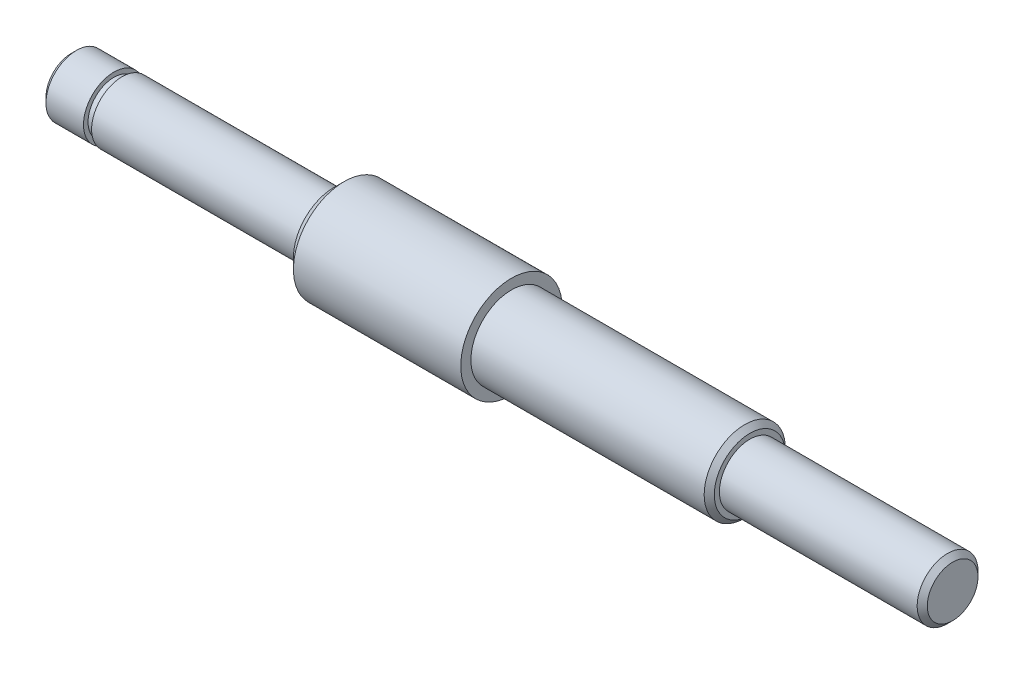
ISO-10303-21;
HEADER;
FILE_DESCRIPTION(('STEP AP214'),'2;1');
FILE_NAME('part.step','',(''),(''),'','','');
FILE_SCHEMA(('AUTOMOTIVE_DESIGN { 1 0 10303 214 1 1 1 1 }'));
ENDSEC;
DATA;
#1=APPLICATION_CONTEXT('core data for automotive mechanical design processes');
#2=APPLICATION_PROTOCOL_DEFINITION('international standard','automotive_design',2000,#1);
#3=PRODUCT_CONTEXT('',#1,'mechanical');
#4=PRODUCT('Part','Part','',(#3));
#5=PRODUCT_RELATED_PRODUCT_CATEGORY('part','',(#4));
#6=PRODUCT_DEFINITION_FORMATION('','',#4);
#7=PRODUCT_DEFINITION_CONTEXT('part definition',#1,'design');
#8=PRODUCT_DEFINITION('design','',#6,#7);
#9=PRODUCT_DEFINITION_SHAPE('','',#8);
#10=(LENGTH_UNIT() NAMED_UNIT(*) SI_UNIT(.MILLI.,.METRE.));
#11=(NAMED_UNIT(*) PLANE_ANGLE_UNIT() SI_UNIT($,.RADIAN.));
#12=(NAMED_UNIT(*) SI_UNIT($,.STERADIAN.) SOLID_ANGLE_UNIT());
#13=UNCERTAINTY_MEASURE_WITH_UNIT(LENGTH_MEASURE(1.E-05),#10,'distance_accuracy_value','');
#14=(GEOMETRIC_REPRESENTATION_CONTEXT(3) GLOBAL_UNCERTAINTY_ASSIGNED_CONTEXT((#13)) GLOBAL_UNIT_ASSIGNED_CONTEXT((#10,
#11,#12)) REPRESENTATION_CONTEXT('',''));
#15=CARTESIAN_POINT('',(0.,0.,0.));
#16=DIRECTION('',(0.,0.,1.));
#17=DIRECTION('',(1.,0.,0.));
#18=AXIS2_PLACEMENT_3D('',#15,#16,#17);
#19=CARTESIAN_POINT('',(43.45,0.,0.));
#20=DIRECTION('',(-1.,0.,0.));
#21=DIRECTION('',(0.,0.,1.));
#22=AXIS2_PLACEMENT_3D('',#19,#20,#21);
#23=PLANE('',#22);
#24=CARTESIAN_POINT('',(43.45,0.,0.));
#25=DIRECTION('',(-1.,0.,0.));
#26=DIRECTION('',(0.,0.,1.));
#27=AXIS2_PLACEMENT_3D('',#24,#25,#26);
#28=CIRCLE('',#27,2.50000000000006);
#29=CARTESIAN_POINT('',(43.45,0.,2.50000000000006));
#30=VERTEX_POINT('',#29);
#31=EDGE_CURVE('E64',#30,#30,#28,.F.);
#32=ORIENTED_EDGE('',*,*,#31,.T.);
#33=EDGE_LOOP('',(#32));
#34=FACE_BOUND('',#33,.T.);
#35=ADVANCED_FACE('F43',(#34),#23,.F.);
#36=CARTESIAN_POINT('',(43.45,0.,0.));
#37=DIRECTION('',(1.,0.,0.));
#38=DIRECTION('',(0.,0.,-1.));
#39=AXIS2_PLACEMENT_3D('',#36,#37,#38);
#40=CYLINDRICAL_SURFACE('',#39,3.00000000000002);
#41=CARTESIAN_POINT('',(42.95,0.,0.));
#42=DIRECTION('',(-1.,0.,0.));
#43=DIRECTION('',(0.,0.,1.));
#44=AXIS2_PLACEMENT_3D('',#41,#42,#43);
#45=CIRCLE('',#44,3.00000000000002);
#46=CARTESIAN_POINT('',(42.95,0.,3.00000000000002));
#47=VERTEX_POINT('',#46);
#48=EDGE_CURVE('E58',#47,#47,#45,.T.);
#49=ORIENTED_EDGE('',*,*,#48,.T.);
#50=EDGE_LOOP('',(#49));
#51=FACE_BOUND('',#50,.T.);
#52=CARTESIAN_POINT('',(23.45,0.,0.));
#53=DIRECTION('',(1.,0.,0.));
#54=DIRECTION('',(0.,0.,-1.));
#55=AXIS2_PLACEMENT_3D('',#52,#53,#54);
#56=CIRCLE('',#55,3.);
#57=CARTESIAN_POINT('',(23.45,0.,-3.));
#58=VERTEX_POINT('',#57);
#59=EDGE_CURVE('E86',#58,#58,#56,.T.);
#60=ORIENTED_EDGE('',*,*,#59,.T.);
#61=EDGE_LOOP('',(#60));
#62=FACE_BOUND('',#61,.T.);
#63=ADVANCED_FACE('F139',(#51,#62),#40,.T.);
#64=CARTESIAN_POINT('',(23.45,0.,3.));
#65=DIRECTION('',(-1.,0.,0.));
#66=DIRECTION('',(0.,0.,1.));
#67=AXIS2_PLACEMENT_3D('',#64,#65,#66);
#68=PLANE('',#67);
#69=CARTESIAN_POINT('',(23.45,0.,0.));
#70=DIRECTION('',(-1.,0.,0.));
#71=DIRECTION('',(0.,0.,1.));
#72=AXIS2_PLACEMENT_3D('',#69,#70,#71);
#73=CIRCLE('',#72,3.5);
#74=CARTESIAN_POINT('',(23.45,0.,3.5));
#75=VERTEX_POINT('',#74);
#76=EDGE_CURVE('E82',#75,#75,#73,.F.);
#77=ORIENTED_EDGE('',*,*,#76,.T.);
#78=EDGE_LOOP('',(#77));
#79=FACE_BOUND('',#78,.T.);
#80=ORIENTED_EDGE('',*,*,#59,.F.);
#81=EDGE_LOOP('',(#80));
#82=FACE_BOUND('',#81,.T.);
#83=ADVANCED_FACE('F145',(#79,#82),#68,.F.);
#84=CARTESIAN_POINT('',(43.45,0.,0.));
#85=DIRECTION('',(1.,0.,0.));
#86=DIRECTION('',(0.,0.,-1.));
#87=AXIS2_PLACEMENT_3D('',#84,#85,#86);
#88=CYLINDRICAL_SURFACE('',#87,4.);
#89=CARTESIAN_POINT('',(22.95,0.,0.));
#90=DIRECTION('',(-1.,0.,0.));
#91=DIRECTION('',(0.,0.,1.));
#92=AXIS2_PLACEMENT_3D('',#89,#90,#91);
#93=CIRCLE('',#92,4.);
#94=CARTESIAN_POINT('',(22.95,0.,4.));
#95=VERTEX_POINT('',#94);
#96=EDGE_CURVE('E78',#95,#95,#93,.T.);
#97=ORIENTED_EDGE('',*,*,#96,.T.);
#98=EDGE_LOOP('',(#97));
#99=FACE_BOUND('',#98,.T.);
#100=CARTESIAN_POINT('',(-0.0499999999999945,0.,0.));
#101=DIRECTION('',(1.,0.,0.));
#102=DIRECTION('',(0.,0.,-1.));
#103=AXIS2_PLACEMENT_3D('',#100,#101,#102);
#104=CIRCLE('',#103,4.);
#105=CARTESIAN_POINT('',(-0.0499999999999945,0.,-4.));
#106=VERTEX_POINT('',#105);
#107=EDGE_CURVE('E90',#106,#106,#104,.T.);
#108=ORIENTED_EDGE('',*,*,#107,.T.);
#109=EDGE_LOOP('',(#108));
#110=FACE_BOUND('',#109,.T.);
#111=ADVANCED_FACE('F180',(#99,#110),#88,.T.);
#112=CARTESIAN_POINT('',(-0.0499999999999978,0.,4.));
#113=DIRECTION('',(-1.,0.,0.));
#114=DIRECTION('',(0.,0.,1.));
#115=AXIS2_PLACEMENT_3D('',#112,#113,#114);
#116=PLANE('',#115);
#117=ORIENTED_EDGE('',*,*,#107,.F.);
#118=EDGE_LOOP('',(#117));
#119=FACE_BOUND('',#118,.T.);
#120=CARTESIAN_POINT('',(-0.0499999999999945,0.,0.));
#121=DIRECTION('',(1.,0.,0.));
#122=DIRECTION('',(0.,0.,-1.));
#123=AXIS2_PLACEMENT_3D('',#120,#121,#122);
#124=CIRCLE('',#123,5.);
#125=CARTESIAN_POINT('',(-0.0499999999999945,0.,-5.));
#126=VERTEX_POINT('',#125);
#127=EDGE_CURVE('E94',#126,#126,#124,.T.);
#128=ORIENTED_EDGE('',*,*,#127,.T.);
#129=EDGE_LOOP('',(#128));
#130=FACE_BOUND('',#129,.T.);
#131=ADVANCED_FACE('F184',(#119,#130),#116,.F.);
#132=CARTESIAN_POINT('',(43.45,0.,0.));
#133=DIRECTION('',(1.,0.,0.));
#134=DIRECTION('',(0.,0.,-1.));
#135=AXIS2_PLACEMENT_3D('',#132,#133,#134);
#136=CYLINDRICAL_SURFACE('',#135,5.);
#137=CARTESIAN_POINT('',(-16.55,0.,0.));
#138=DIRECTION('',(1.,0.,0.));
#139=DIRECTION('',(0.,0.,-1.));
#140=AXIS2_PLACEMENT_3D('',#137,#138,#139);
#141=CIRCLE('',#140,5.);
#142=CARTESIAN_POINT('',(-16.55,0.,-5.));
#143=VERTEX_POINT('',#142);
#144=EDGE_CURVE('E52',#143,#143,#141,.T.);
#145=ORIENTED_EDGE('',*,*,#144,.T.);
#146=EDGE_LOOP('',(#145));
#147=FACE_BOUND('',#146,.T.);
#148=ORIENTED_EDGE('',*,*,#127,.F.);
#149=EDGE_LOOP('',(#148));
#150=FACE_BOUND('',#149,.T.);
#151=ADVANCED_FACE('F190',(#147,#150),#136,.T.);
#152=CARTESIAN_POINT('',(-17.55,0.,5.));
#153=DIRECTION('',(1.,0.,0.));
#154=DIRECTION('',(0.,0.,-1.));
#155=AXIS2_PLACEMENT_3D('',#152,#153,#154);
#156=PLANE('',#155);
#157=CARTESIAN_POINT('',(-17.55,0.,0.));
#158=DIRECTION('',(1.,0.,0.));
#159=DIRECTION('',(0.,0.,-1.));
#160=AXIS2_PLACEMENT_3D('',#157,#158,#159);
#161=CIRCLE('',#160,3.99999999999999);
#162=CARTESIAN_POINT('',(-17.55,0.,-3.99999999999999));
#163=VERTEX_POINT('',#162);
#164=EDGE_CURVE('E10',#163,#163,#161,.F.);
#165=ORIENTED_EDGE('',*,*,#164,.T.);
#166=EDGE_LOOP('',(#165));
#167=FACE_BOUND('',#166,.T.);
#168=CARTESIAN_POINT('',(-17.55,0.,0.));
#169=DIRECTION('',(1.,0.,0.));
#170=DIRECTION('',(0.,0.,-1.));
#171=AXIS2_PLACEMENT_3D('',#168,#169,#170);
#172=CIRCLE('',#171,3.);
#173=CARTESIAN_POINT('',(-17.55,0.,-3.));
#174=VERTEX_POINT('',#173);
#175=EDGE_CURVE('E98',#174,#174,#172,.T.);
#176=ORIENTED_EDGE('',*,*,#175,.T.);
#177=EDGE_LOOP('',(#176));
#178=FACE_BOUND('',#177,.T.);
#179=ADVANCED_FACE('F193',(#167,#178),#156,.F.);
#180=CARTESIAN_POINT('',(43.45,0.,0.));
#181=DIRECTION('',(1.,0.,0.));
#182=DIRECTION('',(0.,0.,-1.));
#183=AXIS2_PLACEMENT_3D('',#180,#181,#182);
#184=CYLINDRICAL_SURFACE('',#183,3.);
#185=ORIENTED_EDGE('',*,*,#175,.F.);
#186=EDGE_LOOP('',(#185));
#187=FACE_BOUND('',#186,.T.);
#188=CARTESIAN_POINT('',(-38.45,0.,0.));
#189=DIRECTION('',(1.,0.,0.));
#190=DIRECTION('',(0.,0.,-1.));
#191=AXIS2_PLACEMENT_3D('',#188,#189,#190);
#192=CIRCLE('',#191,3.);
#193=CARTESIAN_POINT('',(-38.45,0.,-3.));
#194=VERTEX_POINT('',#193);
#195=EDGE_CURVE('E102',#194,#194,#192,.T.);
#196=ORIENTED_EDGE('',*,*,#195,.T.);
#197=EDGE_LOOP('',(#196));
#198=FACE_BOUND('',#197,.T.);
#199=ADVANCED_FACE('F196',(#187,#198),#184,.T.);
#200=CARTESIAN_POINT('',(-38.45,0.,3.));
#201=DIRECTION('',(1.,0.,0.));
#202=DIRECTION('',(0.,0.,-1.));
#203=AXIS2_PLACEMENT_3D('',#200,#201,#202);
#204=PLANE('',#203);
#205=ORIENTED_EDGE('',*,*,#195,.F.);
#206=EDGE_LOOP('',(#205));
#207=FACE_BOUND('',#206,.T.);
#208=CARTESIAN_POINT('',(-38.45,0.,0.));
#209=DIRECTION('',(1.,0.,0.));
#210=DIRECTION('',(0.,0.,-1.));
#211=AXIS2_PLACEMENT_3D('',#208,#209,#210);
#212=CIRCLE('',#211,2.54999999999999);
#213=CARTESIAN_POINT('',(-38.45,0.,-2.54999999999999));
#214=VERTEX_POINT('',#213);
#215=EDGE_CURVE('E106',#214,#214,#212,.T.);
#216=ORIENTED_EDGE('',*,*,#215,.T.);
#217=EDGE_LOOP('',(#216));
#218=FACE_BOUND('',#217,.T.);
#219=ADVANCED_FACE('F199',(#207,#218),#204,.F.);
#220=CARTESIAN_POINT('',(43.45,0.,0.));
#221=DIRECTION('',(1.,0.,0.));
#222=DIRECTION('',(0.,0.,-1.));
#223=AXIS2_PLACEMENT_3D('',#220,#221,#222);
#224=CYLINDRICAL_SURFACE('',#223,2.54999999999999);
#225=ORIENTED_EDGE('',*,*,#215,.F.);
#226=EDGE_LOOP('',(#225));
#227=FACE_BOUND('',#226,.T.);
#228=CARTESIAN_POINT('',(-39.25,0.,0.));
#229=DIRECTION('',(1.,0.,0.));
#230=DIRECTION('',(0.,0.,-1.));
#231=AXIS2_PLACEMENT_3D('',#228,#229,#230);
#232=CIRCLE('',#231,2.54999999999999);
#233=CARTESIAN_POINT('',(-39.25,0.,-2.54999999999999));
#234=VERTEX_POINT('',#233);
#235=EDGE_CURVE('E110',#234,#234,#232,.T.);
#236=ORIENTED_EDGE('',*,*,#235,.T.);
#237=EDGE_LOOP('',(#236));
#238=FACE_BOUND('',#237,.T.);
#239=ADVANCED_FACE('F135',(#227,#238),#224,.T.);
#240=CARTESIAN_POINT('',(-39.25,0.,2.54999999999999));
#241=DIRECTION('',(-1.,0.,0.));
#242=DIRECTION('',(0.,0.,1.));
#243=AXIS2_PLACEMENT_3D('',#240,#241,#242);
#244=PLANE('',#243);
#245=ORIENTED_EDGE('',*,*,#235,.F.);
#246=EDGE_LOOP('',(#245));
#247=FACE_BOUND('',#246,.T.);
#248=CARTESIAN_POINT('',(-39.25,0.,0.));
#249=DIRECTION('',(1.,0.,0.));
#250=DIRECTION('',(0.,0.,-1.));
#251=AXIS2_PLACEMENT_3D('',#248,#249,#250);
#252=CIRCLE('',#251,3.);
#253=CARTESIAN_POINT('',(-39.25,0.,-3.));
#254=VERTEX_POINT('',#253);
#255=EDGE_CURVE('E114',#254,#254,#252,.T.);
#256=ORIENTED_EDGE('',*,*,#255,.T.);
#257=EDGE_LOOP('',(#256));
#258=FACE_BOUND('',#257,.T.);
#259=ADVANCED_FACE('F120',(#247,#258),#244,.F.);
#260=CARTESIAN_POINT('',(43.45,0.,0.));
#261=DIRECTION('',(1.,0.,0.));
#262=DIRECTION('',(0.,0.,-1.));
#263=AXIS2_PLACEMENT_3D('',#260,#261,#262);
#264=CYLINDRICAL_SURFACE('',#263,3.00000000000002);
#265=CARTESIAN_POINT('',(-42.95,0.,0.));
#266=DIRECTION('',(1.,0.,0.));
#267=DIRECTION('',(0.,0.,-1.));
#268=AXIS2_PLACEMENT_3D('',#265,#266,#267);
#269=CIRCLE('',#268,3.00000000000002);
#270=CARTESIAN_POINT('',(-42.95,0.,-3.00000000000002));
#271=VERTEX_POINT('',#270);
#272=EDGE_CURVE('E74',#271,#271,#269,.T.);
#273=ORIENTED_EDGE('',*,*,#272,.T.);
#274=EDGE_LOOP('',(#273));
#275=FACE_BOUND('',#274,.T.);
#276=ORIENTED_EDGE('',*,*,#255,.F.);
#277=EDGE_LOOP('',(#276));
#278=FACE_BOUND('',#277,.T.);
#279=ADVANCED_FACE('F122',(#275,#278),#264,.T.);
#280=CARTESIAN_POINT('',(-43.45,0.,3.00000000000005));
#281=DIRECTION('',(1.,0.,0.));
#282=DIRECTION('',(0.,0.,-1.));
#283=AXIS2_PLACEMENT_3D('',#280,#281,#282);
#284=PLANE('',#283);
#285=CARTESIAN_POINT('',(-43.45,0.,0.));
#286=DIRECTION('',(1.,0.,0.));
#287=DIRECTION('',(0.,0.,-1.));
#288=AXIS2_PLACEMENT_3D('',#285,#286,#287);
#289=CIRCLE('',#288,2.50000000000003);
#290=CARTESIAN_POINT('',(-43.45,0.,-2.50000000000003));
#291=VERTEX_POINT('',#290);
#292=EDGE_CURVE('E70',#291,#291,#289,.F.);
#293=ORIENTED_EDGE('',*,*,#292,.T.);
#294=EDGE_LOOP('',(#293));
#295=FACE_BOUND('',#294,.T.);
#296=ADVANCED_FACE('F124',(#295),#284,.F.);
#297=CARTESIAN_POINT('',(23.45,0.,0.));
#298=DIRECTION('',(-1.,0.,0.));
#299=DIRECTION('',(0.,0.,1.));
#300=AXIS2_PLACEMENT_3D('',#297,#298,#299);
#301=CONICAL_SURFACE('',#300,3.5,0.785398163397448);
#302=ORIENTED_EDGE('',*,*,#96,.F.);
#303=EDGE_LOOP('',(#302));
#304=FACE_BOUND('',#303,.T.);
#305=ORIENTED_EDGE('',*,*,#76,.F.);
#306=EDGE_LOOP('',(#305));
#307=FACE_BOUND('',#306,.T.);
#308=ADVANCED_FACE('F131',(#304,#307),#301,.T.);
#309=CARTESIAN_POINT('',(-42.95,0.,0.));
#310=DIRECTION('',(1.,0.,0.));
#311=DIRECTION('',(0.,0.,-1.));
#312=AXIS2_PLACEMENT_3D('',#309,#310,#311);
#313=CONICAL_SURFACE('',#312,3.00000000000002,0.785398163397454);
#314=ORIENTED_EDGE('',*,*,#292,.F.);
#315=EDGE_LOOP('',(#314));
#316=FACE_BOUND('',#315,.T.);
#317=ORIENTED_EDGE('',*,*,#272,.F.);
#318=EDGE_LOOP('',(#317));
#319=FACE_BOUND('',#318,.T.);
#320=ADVANCED_FACE('F156',(#316,#319),#313,.T.);
#321=CARTESIAN_POINT('',(43.45,0.,0.));
#322=DIRECTION('',(-1.,0.,0.));
#323=DIRECTION('',(0.,0.,1.));
#324=AXIS2_PLACEMENT_3D('',#321,#322,#323);
#325=CONICAL_SURFACE('',#324,2.50000000000006,0.785398163397441);
#326=ORIENTED_EDGE('',*,*,#48,.F.);
#327=EDGE_LOOP('',(#326));
#328=FACE_BOUND('',#327,.T.);
#329=ORIENTED_EDGE('',*,*,#31,.F.);
#330=EDGE_LOOP('',(#329));
#331=FACE_BOUND('',#330,.T.);
#332=ADVANCED_FACE('F162',(#328,#331),#325,.T.);
#333=CARTESIAN_POINT('',(-16.55,0.,0.));
#334=DIRECTION('',(1.,0.,0.));
#335=DIRECTION('',(0.,0.,-1.));
#336=AXIS2_PLACEMENT_3D('',#333,#334,#335);
#337=CONICAL_SURFACE('',#336,5.,0.785398163397446);
#338=ORIENTED_EDGE('',*,*,#164,.F.);
#339=EDGE_LOOP('',(#338));
#340=FACE_BOUND('',#339,.T.);
#341=ORIENTED_EDGE('',*,*,#144,.F.);
#342=EDGE_LOOP('',(#341));
#343=FACE_BOUND('',#342,.T.);
#344=ADVANCED_FACE('F46',(#340,#343),#337,.T.);
#345=CLOSED_SHELL('',(#35,#63,#83,#111,#131,#151,#179,#199,#219,#239,#259,#279,#296,#308,#320,
#332,#344));
#346=MANIFOLD_SOLID_BREP('B2',#345);
#347=ADVANCED_BREP_SHAPE_REPRESENTATION('',(#18,#346),#14);
#348=SHAPE_DEFINITION_REPRESENTATION(#9,#347);
ENDSEC;
END-ISO-10303-21;
